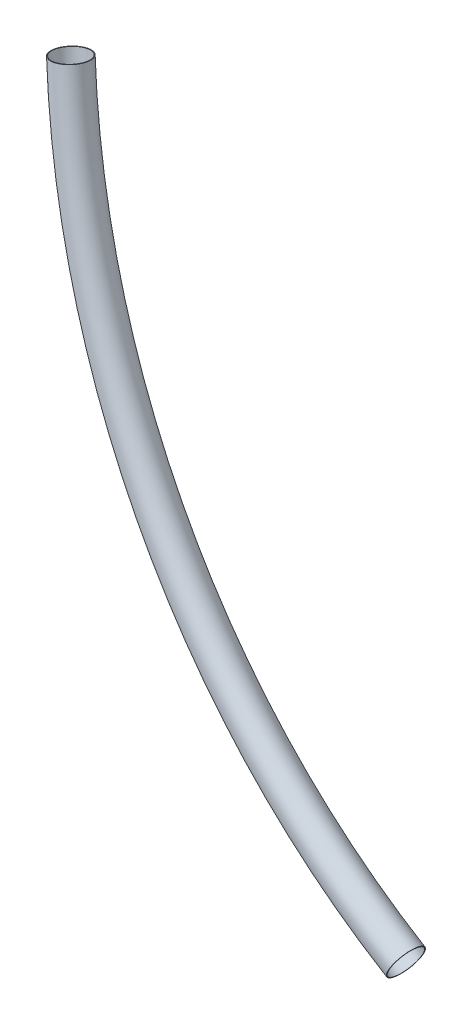
ISO-10303-21;
HEADER;
FILE_DESCRIPTION(('STEP AP214'),'2;1');
FILE_NAME('part.step','',(''),(''),'','','');
FILE_SCHEMA(('AUTOMOTIVE_DESIGN { 1 0 10303 214 1 1 1 1 }'));
ENDSEC;
DATA;
#1=APPLICATION_CONTEXT('core data for automotive mechanical design processes');
#2=APPLICATION_PROTOCOL_DEFINITION('international standard','automotive_design',2000,#1);
#3=PRODUCT_CONTEXT('',#1,'mechanical');
#4=PRODUCT('Part','Part','',(#3));
#5=PRODUCT_RELATED_PRODUCT_CATEGORY('part','',(#4));
#6=PRODUCT_DEFINITION_FORMATION('','',#4);
#7=PRODUCT_DEFINITION_CONTEXT('part definition',#1,'design');
#8=PRODUCT_DEFINITION('design','',#6,#7);
#9=PRODUCT_DEFINITION_SHAPE('','',#8);
#10=(LENGTH_UNIT() NAMED_UNIT(*) SI_UNIT(.MILLI.,.METRE.));
#11=(NAMED_UNIT(*) PLANE_ANGLE_UNIT() SI_UNIT($,.RADIAN.));
#12=(NAMED_UNIT(*) SI_UNIT($,.STERADIAN.) SOLID_ANGLE_UNIT());
#13=UNCERTAINTY_MEASURE_WITH_UNIT(LENGTH_MEASURE(1.E-05),#10,'distance_accuracy_value','');
#14=(GEOMETRIC_REPRESENTATION_CONTEXT(3) GLOBAL_UNCERTAINTY_ASSIGNED_CONTEXT((#13)) GLOBAL_UNIT_ASSIGNED_CONTEXT((#10,
#11,#12)) REPRESENTATION_CONTEXT('',''));
#15=CARTESIAN_POINT('',(0.,0.,0.));
#16=DIRECTION('',(0.,0.,1.));
#17=DIRECTION('',(1.,0.,0.));
#18=AXIS2_PLACEMENT_3D('',#15,#16,#17);
#19=CARTESIAN_POINT('',(2726.48499668671,-153.012779532557,3316.90545209789));
#20=DIRECTION('',(0.0104734902862252,0.138891611041555,0.990252203422697));
#21=DIRECTION('',(0.,-0.990306520253405,0.138899229456437));
#22=AXIS2_PLACEMENT_3D('',#19,#20,#21);
#23=TOROIDAL_SURFACE('',#22,3759.40261554376,80.7339);
#24=CARTESIAN_POINT('',(-974.729442762843,-798.988500121382,3446.65547089212));
#25=DIRECTION('',(-0.174948026873818,0.975286518769415,-0.134942188360773));
#26=DIRECTION('',(-0.977693389001447,-0.188264566295856,-0.0931240580102592));
#27=AXIS2_PLACEMENT_3D('',#24,#25,#26);
#28=CIRCLE('',#27,80.7339);
#29=CARTESIAN_POINT('',(-1054.21374040034,-812.860953955621,3449.44187770022));
#30=VERTEX_POINT('',#29);
#31=EDGE_CURVE('E43',#30,#30,#28,.T.);
#32=CARTESIAN_POINT('',(1016.63933489675,-3466.08789016431,3799.67781038666));
#33=DIRECTION('',(-0.890522591322084,0.451729947381443,-0.0539404206857887));
#34=DIRECTION('',(-0.452388554649849,-0.891820943699923,0.));
#35=AXIS2_PLACEMENT_3D('',#32,#33,#34);
#36=CIRCLE('',#35,80.7339);
#37=CARTESIAN_POINT('',(979.920067823939,-3537.23682046731,3810.04544037545));
#38=VERTEX_POINT('',#37);
#39=EDGE_CURVE('E51',#38,#38,#36,.T.);
#40=CARTESIAN_POINT('',(2726.48499668671,-153.012779532557,3316.90545209789));
#41=DIRECTION('',(0.0104734902862252,0.138891611041555,0.990252203422697));
#42=DIRECTION('',(0.,-0.990306520253405,0.138899229456437));
#43=AXIS2_PLACEMENT_3D('',#40,#41,#42);
#44=CIRCLE('',#43,3840.13651554376);
#45=EDGE_CURVE('',#30,#38,#44,.T.);
#46=ORIENTED_EDGE('',*,*,#31,.T.);
#47=ORIENTED_EDGE('',*,*,#39,.F.);
#48=ORIENTED_EDGE('',*,*,#45,.T.);
#49=ORIENTED_EDGE('',*,*,#45,.F.);
#50=EDGE_LOOP('',(#46,#48,#47,#49));
#51=FACE_BOUND('',#50,.T.);
#52=ADVANCED_FACE('F36',(#51),#23,.F.);
#53=CARTESIAN_POINT('',(2726.48499668671,-153.012779532557,3316.90545209789));
#54=DIRECTION('',(0.0104734902862252,0.138891611041555,0.990252203422697));
#55=DIRECTION('',(0.,-0.990306520253405,0.138899229456437));
#56=AXIS2_PLACEMENT_3D('',#53,#54,#55);
#57=TOROIDAL_SURFACE('',#56,3759.40261554376,84.1374999999999);
#58=CARTESIAN_POINT('',(-974.729442762843,-798.988500121382,3446.65547089212));
#59=DIRECTION('',(-0.174948026873818,0.975286518769415,-0.134942188360773));
#60=DIRECTION('',(-0.977693389001447,-0.188264566295856,-0.0931240580102592));
#61=AXIS2_PLACEMENT_3D('',#58,#59,#60);
#62=CIRCLE('',#61,84.1374999999999);
#63=CARTESIAN_POINT('',(-1057.56465935061,-813.445792342843,3449.55934773712));
#64=VERTEX_POINT('',#63);
#65=EDGE_CURVE('E11',#64,#64,#62,.T.);
#66=CARTESIAN_POINT('',(1016.63933489675,-3466.08789016431,3799.67781038666));
#67=DIRECTION('',(-0.890522591322084,0.451729947381443,-0.0539404206857887));
#68=DIRECTION('',(-0.452388554649849,-0.891820943699923,0.));
#69=AXIS2_PLACEMENT_3D('',#66,#67,#68);
#70=CIRCLE('',#69,84.1374999999999);
#71=CARTESIAN_POINT('',(978.37204775543,-3540.23633491142,3810.48252152017));
#72=VERTEX_POINT('',#71);
#73=EDGE_CURVE('E47',#72,#72,#70,.T.);
#74=CARTESIAN_POINT('',(2726.48499668671,-153.012779532557,3316.90545209789));
#75=DIRECTION('',(0.0104734902862252,0.138891611041555,0.990252203422697));
#76=DIRECTION('',(0.,-0.990306520253405,0.138899229456437));
#77=AXIS2_PLACEMENT_3D('',#74,#75,#76);
#78=CIRCLE('',#77,3843.54011554376);
#79=EDGE_CURVE('',#64,#72,#78,.T.);
#80=ORIENTED_EDGE('',*,*,#65,.F.);
#81=ORIENTED_EDGE('',*,*,#73,.T.);
#82=ORIENTED_EDGE('',*,*,#79,.T.);
#83=ORIENTED_EDGE('',*,*,#79,.F.);
#84=EDGE_LOOP('',(#80,#82,#81,#83));
#85=FACE_BOUND('',#84,.T.);
#86=ADVANCED_FACE('F38',(#85),#57,.T.);
#87=CARTESIAN_POINT('',(-974.729442762843,-798.988500121382,3446.65547089212));
#88=DIRECTION('',(-0.174948026873818,0.975286518769415,-0.134942188360773));
#89=DIRECTION('',(-0.977693389001447,-0.188264566295856,-0.0931240580102592));
#90=AXIS2_PLACEMENT_3D('',#87,#88,#89);
#91=PLANE('',#90);
#92=ORIENTED_EDGE('',*,*,#31,.F.);
#93=EDGE_LOOP('',(#92));
#94=FACE_BOUND('',#93,.T.);
#95=ORIENTED_EDGE('',*,*,#65,.T.);
#96=EDGE_LOOP('',(#95));
#97=FACE_BOUND('',#96,.T.);
#98=ADVANCED_FACE('F61',(#94,#97),#91,.T.);
#99=CARTESIAN_POINT('',(1016.63933489675,-3466.08789016431,3799.67781038666));
#100=DIRECTION('',(-0.890522591322084,0.451729947381443,-0.0539404206857887));
#101=DIRECTION('',(-0.452388554649849,-0.891820943699923,0.));
#102=AXIS2_PLACEMENT_3D('',#99,#100,#101);
#103=PLANE('',#102);
#104=ORIENTED_EDGE('',*,*,#39,.T.);
#105=EDGE_LOOP('',(#104));
#106=FACE_BOUND('',#105,.T.);
#107=ORIENTED_EDGE('',*,*,#73,.F.);
#108=EDGE_LOOP('',(#107));
#109=FACE_BOUND('',#108,.T.);
#110=ADVANCED_FACE('F57',(#106,#109),#103,.F.);
#111=CLOSED_SHELL('',(#52,#86,#98,#110));
#112=MANIFOLD_SOLID_BREP('B2',#111);
#113=ADVANCED_BREP_SHAPE_REPRESENTATION('',(#18,#112),#14);
#114=SHAPE_DEFINITION_REPRESENTATION(#9,#113);
ENDSEC;
END-ISO-10303-21;
